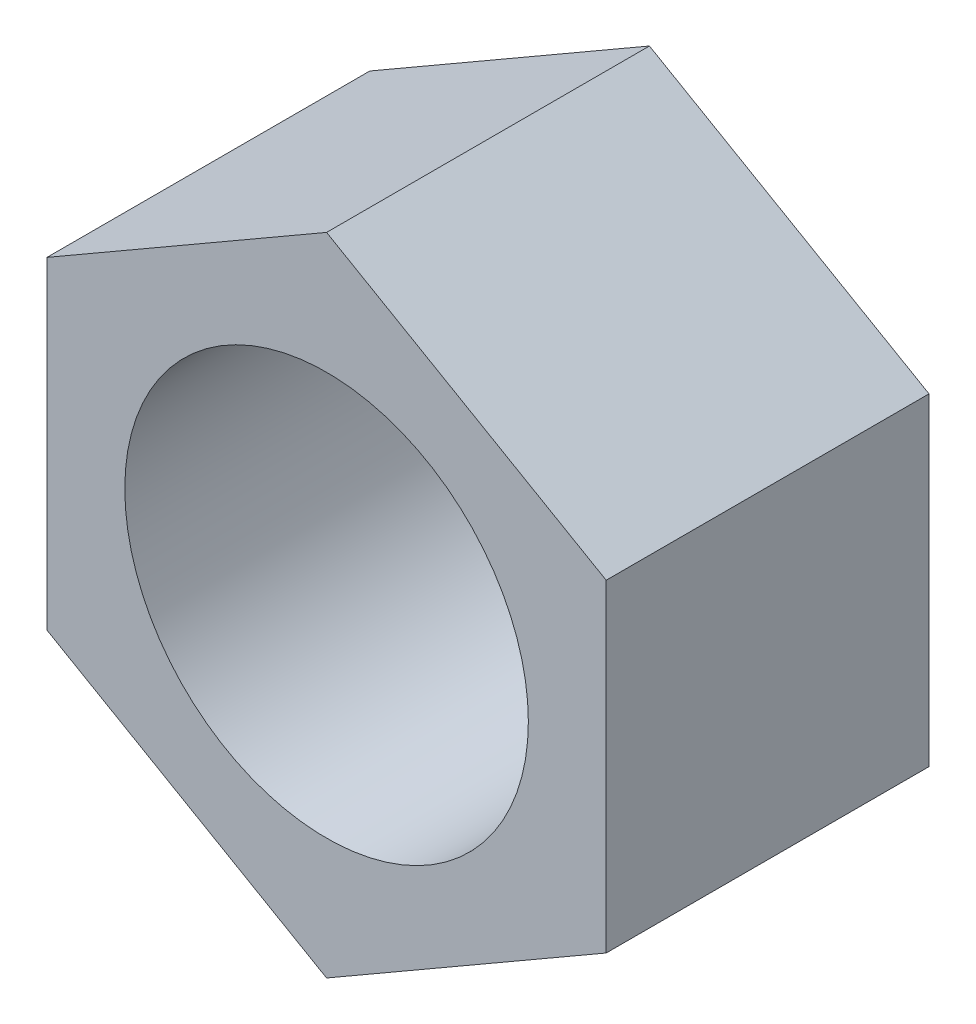
ISO-10303-21;
HEADER;
FILE_DESCRIPTION(('STEP AP214'),'2;1');
FILE_NAME('part.step','',(''),(''),'','','');
FILE_SCHEMA(('AUTOMOTIVE_DESIGN { 1 0 10303 214 1 1 1 1 }'));
ENDSEC;
DATA;
#1=APPLICATION_CONTEXT('core data for automotive mechanical design processes');
#2=APPLICATION_PROTOCOL_DEFINITION('international standard','automotive_design',2000,#1);
#3=PRODUCT_CONTEXT('',#1,'mechanical');
#4=PRODUCT('Part','Part','',(#3));
#5=PRODUCT_RELATED_PRODUCT_CATEGORY('part','',(#4));
#6=PRODUCT_DEFINITION_FORMATION('','',#4);
#7=PRODUCT_DEFINITION_CONTEXT('part definition',#1,'design');
#8=PRODUCT_DEFINITION('design','',#6,#7);
#9=PRODUCT_DEFINITION_SHAPE('','',#8);
#10=(LENGTH_UNIT() NAMED_UNIT(*) SI_UNIT(.MILLI.,.METRE.));
#11=(NAMED_UNIT(*) PLANE_ANGLE_UNIT() SI_UNIT($,.RADIAN.));
#12=(NAMED_UNIT(*) SI_UNIT($,.STERADIAN.) SOLID_ANGLE_UNIT());
#13=UNCERTAINTY_MEASURE_WITH_UNIT(LENGTH_MEASURE(1.E-05),#10,'distance_accuracy_value','');
#14=(GEOMETRIC_REPRESENTATION_CONTEXT(3) GLOBAL_UNCERTAINTY_ASSIGNED_CONTEXT((#13)) GLOBAL_UNIT_ASSIGNED_CONTEXT((#10,
#11,#12)) REPRESENTATION_CONTEXT('',''));
#15=CARTESIAN_POINT('',(0.,0.,0.));
#16=DIRECTION('',(0.,0.,1.));
#17=DIRECTION('',(1.,0.,0.));
#18=AXIS2_PLACEMENT_3D('',#15,#16,#17);
#19=CARTESIAN_POINT('',(-10.3923048454133,-6.00000000000001,12.));
#20=DIRECTION('',(0.5,0.866025403784439,0.));
#21=DIRECTION('',(-0.866025403784439,0.5,0.));
#22=AXIS2_PLACEMENT_3D('',#19,#20,#21);
#23=PLANE('',#22);
#24=DIRECTION('',(0.866025403784439,-0.5,0.));
#25=VECTOR('',#24,1.);
#26=CARTESIAN_POINT('',(-10.3923048454133,-6.00000000000001,0.));
#27=LINE('',#26,#25);
#28=CARTESIAN_POINT('',(-10.3923048454133,-6.00000000000001,0.));
#29=VERTEX_POINT('',#28);
#30=CARTESIAN_POINT('',(0.,-12.,0.));
#31=VERTEX_POINT('',#30);
#32=EDGE_CURVE('E128',#29,#31,#27,.T.);
#33=ORIENTED_EDGE('',*,*,#32,.T.);
#34=DIRECTION('',(0.,0.,-1.));
#35=VECTOR('',#34,1.);
#36=CARTESIAN_POINT('',(0.,-12.,12.));
#37=LINE('',#36,#35);
#38=CARTESIAN_POINT('',(0.,-12.,12.));
#39=VERTEX_POINT('',#38);
#40=EDGE_CURVE('E11',#39,#31,#37,.T.);
#41=ORIENTED_EDGE('',*,*,#40,.F.);
#42=DIRECTION('',(0.866025403784439,-0.5,0.));
#43=VECTOR('',#42,1.);
#44=CARTESIAN_POINT('',(-10.3923048454133,-6.00000000000001,12.));
#45=LINE('',#44,#43);
#46=CARTESIAN_POINT('',(-10.3923048454133,-6.00000000000001,12.));
#47=VERTEX_POINT('',#46);
#48=EDGE_CURVE('E145',#47,#39,#45,.T.);
#49=ORIENTED_EDGE('',*,*,#48,.F.);
#50=DIRECTION('',(0.,0.,-1.));
#51=VECTOR('',#50,1.);
#52=CARTESIAN_POINT('',(-10.3923048454133,-6.00000000000001,12.));
#53=LINE('',#52,#51);
#54=EDGE_CURVE('E124',#47,#29,#53,.T.);
#55=ORIENTED_EDGE('',*,*,#54,.T.);
#56=EDGE_LOOP('',(#33,#41,#49,#55));
#57=FACE_BOUND('',#56,.T.);
#58=ADVANCED_FACE('F39',(#57),#23,.F.);
#59=CARTESIAN_POINT('',(0.,-12.,12.));
#60=DIRECTION('',(-0.5,0.866025403784438,0.));
#61=DIRECTION('',(-0.866025403784438,-0.500000000000001,0.));
#62=AXIS2_PLACEMENT_3D('',#59,#60,#61);
#63=PLANE('',#62);
#64=DIRECTION('',(0.866025403784438,0.500000000000001,0.));
#65=VECTOR('',#64,1.);
#66=CARTESIAN_POINT('',(0.,-12.,0.));
#67=LINE('',#66,#65);
#68=CARTESIAN_POINT('',(10.3923048454133,-6.00000000000002,0.));
#69=VERTEX_POINT('',#68);
#70=EDGE_CURVE('E132',#31,#69,#67,.T.);
#71=ORIENTED_EDGE('',*,*,#70,.T.);
#72=DIRECTION('',(0.,0.,-1.));
#73=VECTOR('',#72,1.);
#74=CARTESIAN_POINT('',(10.3923048454133,-6.00000000000002,12.));
#75=LINE('',#74,#73);
#76=CARTESIAN_POINT('',(10.3923048454133,-6.00000000000002,12.));
#77=VERTEX_POINT('',#76);
#78=EDGE_CURVE('E48',#77,#69,#75,.T.);
#79=ORIENTED_EDGE('',*,*,#78,.F.);
#80=DIRECTION('',(0.866025403784438,0.500000000000001,0.));
#81=VECTOR('',#80,1.);
#82=CARTESIAN_POINT('',(0.,-12.,12.));
#83=LINE('',#82,#81);
#84=EDGE_CURVE('E93',#39,#77,#83,.T.);
#85=ORIENTED_EDGE('',*,*,#84,.F.);
#86=ORIENTED_EDGE('',*,*,#40,.T.);
#87=EDGE_LOOP('',(#71,#79,#85,#86));
#88=FACE_BOUND('',#87,.T.);
#89=ADVANCED_FACE('F174',(#88),#63,.F.);
#90=CARTESIAN_POINT('',(10.3923048454133,-6.00000000000002,12.));
#91=DIRECTION('',(-1.,0.,0.));
#92=DIRECTION('',(0.,-1.,0.));
#93=AXIS2_PLACEMENT_3D('',#90,#91,#92);
#94=PLANE('',#93);
#95=DIRECTION('',(0.,1.,0.));
#96=VECTOR('',#95,1.);
#97=CARTESIAN_POINT('',(10.3923048454133,-6.00000000000002,0.));
#98=LINE('',#97,#96);
#99=CARTESIAN_POINT('',(10.3923048454133,6.,0.));
#100=VERTEX_POINT('',#99);
#101=EDGE_CURVE('E136',#69,#100,#98,.T.);
#102=ORIENTED_EDGE('',*,*,#101,.T.);
#103=DIRECTION('',(0.,0.,-1.));
#104=VECTOR('',#103,1.);
#105=CARTESIAN_POINT('',(10.3923048454133,6.,12.));
#106=LINE('',#105,#104);
#107=CARTESIAN_POINT('',(10.3923048454133,6.,12.));
#108=VERTEX_POINT('',#107);
#109=EDGE_CURVE('E117',#108,#100,#106,.T.);
#110=ORIENTED_EDGE('',*,*,#109,.F.);
#111=DIRECTION('',(0.,1.,0.));
#112=VECTOR('',#111,1.);
#113=CARTESIAN_POINT('',(10.3923048454133,-6.00000000000002,12.));
#114=LINE('',#113,#112);
#115=EDGE_CURVE('E106',#77,#108,#114,.T.);
#116=ORIENTED_EDGE('',*,*,#115,.F.);
#117=ORIENTED_EDGE('',*,*,#78,.T.);
#118=EDGE_LOOP('',(#102,#110,#116,#117));
#119=FACE_BOUND('',#118,.T.);
#120=ADVANCED_FACE('F155',(#119),#94,.F.);
#121=CARTESIAN_POINT('',(10.3923048454133,6.,12.));
#122=DIRECTION('',(-0.5,-0.866025403784439,0.));
#123=DIRECTION('',(0.866025403784439,-0.5,0.));
#124=AXIS2_PLACEMENT_3D('',#121,#122,#123);
#125=PLANE('',#124);
#126=DIRECTION('',(-0.866025403784439,0.5,0.));
#127=VECTOR('',#126,1.);
#128=CARTESIAN_POINT('',(10.3923048454133,6.,0.));
#129=LINE('',#128,#127);
#130=CARTESIAN_POINT('',(0.,12.,0.));
#131=VERTEX_POINT('',#130);
#132=EDGE_CURVE('E115',#100,#131,#129,.T.);
#133=ORIENTED_EDGE('',*,*,#132,.T.);
#134=DIRECTION('',(0.,0.,-1.));
#135=VECTOR('',#134,1.);
#136=CARTESIAN_POINT('',(0.,12.,12.));
#137=LINE('',#136,#135);
#138=CARTESIAN_POINT('',(0.,12.,12.));
#139=VERTEX_POINT('',#138);
#140=EDGE_CURVE('E112',#139,#131,#137,.T.);
#141=ORIENTED_EDGE('',*,*,#140,.F.);
#142=DIRECTION('',(-0.866025403784439,0.5,0.));
#143=VECTOR('',#142,1.);
#144=CARTESIAN_POINT('',(10.3923048454133,6.,12.));
#145=LINE('',#144,#143);
#146=EDGE_CURVE('E100',#108,#139,#145,.T.);
#147=ORIENTED_EDGE('',*,*,#146,.F.);
#148=ORIENTED_EDGE('',*,*,#109,.T.);
#149=EDGE_LOOP('',(#133,#141,#147,#148));
#150=FACE_BOUND('',#149,.T.);
#151=ADVANCED_FACE('F113',(#150),#125,.F.);
#152=CARTESIAN_POINT('',(0.,12.,12.));
#153=DIRECTION('',(0.5,-0.866025403784439,0.));
#154=DIRECTION('',(0.866025403784439,0.5,0.));
#155=AXIS2_PLACEMENT_3D('',#152,#153,#154);
#156=PLANE('',#155);
#157=DIRECTION('',(-0.866025403784439,-0.5,0.));
#158=VECTOR('',#157,1.);
#159=CARTESIAN_POINT('',(0.,12.,0.));
#160=LINE('',#159,#158);
#161=CARTESIAN_POINT('',(-10.3923048454133,5.99999999999999,0.));
#162=VERTEX_POINT('',#161);
#163=EDGE_CURVE('E79',#131,#162,#160,.T.);
#164=ORIENTED_EDGE('',*,*,#163,.T.);
#165=DIRECTION('',(0.,0.,-1.));
#166=VECTOR('',#165,1.);
#167=CARTESIAN_POINT('',(-10.3923048454133,5.99999999999999,12.));
#168=LINE('',#167,#166);
#169=CARTESIAN_POINT('',(-10.3923048454133,5.99999999999999,12.));
#170=VERTEX_POINT('',#169);
#171=EDGE_CURVE('E118',#170,#162,#168,.T.);
#172=ORIENTED_EDGE('',*,*,#171,.F.);
#173=DIRECTION('',(-0.866025403784439,-0.5,0.));
#174=VECTOR('',#173,1.);
#175=CARTESIAN_POINT('',(0.,12.,12.));
#176=LINE('',#175,#174);
#177=EDGE_CURVE('E104',#139,#170,#176,.T.);
#178=ORIENTED_EDGE('',*,*,#177,.F.);
#179=ORIENTED_EDGE('',*,*,#140,.T.);
#180=EDGE_LOOP('',(#164,#172,#178,#179));
#181=FACE_BOUND('',#180,.T.);
#182=ADVANCED_FACE('F120',(#181),#156,.F.);
#183=CARTESIAN_POINT('',(-10.3923048454133,5.99999999999999,12.));
#184=DIRECTION('',(1.,0.,0.));
#185=DIRECTION('',(0.,1.,0.));
#186=AXIS2_PLACEMENT_3D('',#183,#184,#185);
#187=PLANE('',#186);
#188=DIRECTION('',(0.,-1.,0.));
#189=VECTOR('',#188,1.);
#190=CARTESIAN_POINT('',(-10.3923048454133,5.99999999999999,0.));
#191=LINE('',#190,#189);
#192=EDGE_CURVE('E85',#162,#29,#191,.T.);
#193=ORIENTED_EDGE('',*,*,#192,.T.);
#194=ORIENTED_EDGE('',*,*,#54,.F.);
#195=DIRECTION('',(0.,-1.,0.));
#196=VECTOR('',#195,1.);
#197=CARTESIAN_POINT('',(-10.3923048454133,5.99999999999999,12.));
#198=LINE('',#197,#196);
#199=EDGE_CURVE('E56',#170,#47,#198,.T.);
#200=ORIENTED_EDGE('',*,*,#199,.F.);
#201=ORIENTED_EDGE('',*,*,#171,.T.);
#202=EDGE_LOOP('',(#193,#194,#200,#201));
#203=FACE_BOUND('',#202,.T.);
#204=ADVANCED_FACE('F162',(#203),#187,.F.);
#205=CARTESIAN_POINT('',(0.,0.,12.));
#206=DIRECTION('',(0.,0.,1.));
#207=DIRECTION('',(1.,0.,0.));
#208=AXIS2_PLACEMENT_3D('',#205,#206,#207);
#209=PLANE('',#208);
#210=CARTESIAN_POINT('',(0.,0.,12.));
#211=DIRECTION('',(0.,0.,1.));
#212=DIRECTION('',(1.,0.,0.));
#213=AXIS2_PLACEMENT_3D('',#210,#211,#212);
#214=CIRCLE('',#213,7.5);
#215=CARTESIAN_POINT('',(7.5,0.,12.));
#216=VERTEX_POINT('',#215);
#217=EDGE_CURVE('E133',#216,#216,#214,.T.);
#218=ORIENTED_EDGE('',*,*,#217,.F.);
#219=EDGE_LOOP('',(#218));
#220=FACE_BOUND('',#219,.T.);
#221=ORIENTED_EDGE('',*,*,#48,.T.);
#222=ORIENTED_EDGE('',*,*,#84,.T.);
#223=ORIENTED_EDGE('',*,*,#115,.T.);
#224=ORIENTED_EDGE('',*,*,#146,.T.);
#225=ORIENTED_EDGE('',*,*,#177,.T.);
#226=ORIENTED_EDGE('',*,*,#199,.T.);
#227=EDGE_LOOP('',(#221,#222,#223,#224,#225,#226));
#228=FACE_BOUND('',#227,.T.);
#229=ADVANCED_FACE('F102',(#220,#228),#209,.T.);
#230=CARTESIAN_POINT('',(0.,0.,0.));
#231=DIRECTION('',(0.,0.,1.));
#232=DIRECTION('',(1.,0.,0.));
#233=AXIS2_PLACEMENT_3D('',#230,#231,#232);
#234=PLANE('',#233);
#235=CARTESIAN_POINT('',(0.,0.,0.));
#236=DIRECTION('',(0.,0.,1.));
#237=DIRECTION('',(1.,0.,0.));
#238=AXIS2_PLACEMENT_3D('',#235,#236,#237);
#239=CIRCLE('',#238,7.5);
#240=CARTESIAN_POINT('',(7.5,0.,0.));
#241=VERTEX_POINT('',#240);
#242=EDGE_CURVE('E229',#241,#241,#239,.T.);
#243=ORIENTED_EDGE('',*,*,#242,.T.);
#244=EDGE_LOOP('',(#243));
#245=FACE_BOUND('',#244,.T.);
#246=ORIENTED_EDGE('',*,*,#32,.F.);
#247=ORIENTED_EDGE('',*,*,#192,.F.);
#248=ORIENTED_EDGE('',*,*,#163,.F.);
#249=ORIENTED_EDGE('',*,*,#132,.F.);
#250=ORIENTED_EDGE('',*,*,#101,.F.);
#251=ORIENTED_EDGE('',*,*,#70,.F.);
#252=EDGE_LOOP('',(#246,#247,#248,#249,#250,#251));
#253=FACE_BOUND('',#252,.T.);
#254=ADVANCED_FACE('F158',(#245,#253),#234,.F.);
#255=CARTESIAN_POINT('',(0.,0.,0.));
#256=DIRECTION('',(0.,0.,1.));
#257=DIRECTION('',(1.,0.,0.));
#258=AXIS2_PLACEMENT_3D('',#255,#256,#257);
#259=CYLINDRICAL_SURFACE('',#258,7.5);
#260=ORIENTED_EDGE('',*,*,#217,.T.);
#261=EDGE_LOOP('',(#260));
#262=FACE_BOUND('',#261,.T.);
#263=ORIENTED_EDGE('',*,*,#242,.F.);
#264=EDGE_LOOP('',(#263));
#265=FACE_BOUND('',#264,.T.);
#266=ADVANCED_FACE('F211',(#262,#265),#259,.F.);
#267=CLOSED_SHELL('',(#58,#89,#120,#151,#182,#204,#229,#254,#266));
#268=MANIFOLD_SOLID_BREP('B2',#267);
#269=ADVANCED_BREP_SHAPE_REPRESENTATION('',(#18,#268),#14);
#270=SHAPE_DEFINITION_REPRESENTATION(#9,#269);
ENDSEC;
END-ISO-10303-21;
